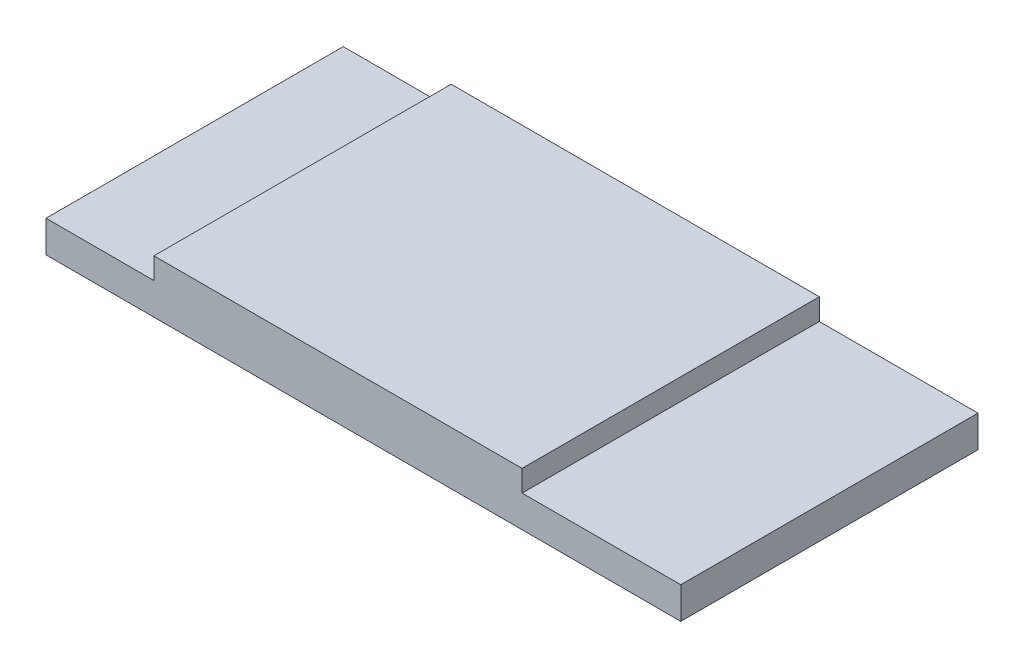
ISO-10303-21;
HEADER;
FILE_DESCRIPTION(('STEP AP214'),'2;1');
FILE_NAME('part.step','',(''),(''),'','','');
FILE_SCHEMA(('AUTOMOTIVE_DESIGN { 1 0 10303 214 1 1 1 1 }'));
ENDSEC;
DATA;
#1=APPLICATION_CONTEXT('core data for automotive mechanical design processes');
#2=APPLICATION_PROTOCOL_DEFINITION('international standard','automotive_design',2000,#1);
#3=PRODUCT_CONTEXT('',#1,'mechanical');
#4=PRODUCT('Part','Part','',(#3));
#5=PRODUCT_RELATED_PRODUCT_CATEGORY('part','',(#4));
#6=PRODUCT_DEFINITION_FORMATION('','',#4);
#7=PRODUCT_DEFINITION_CONTEXT('part definition',#1,'design');
#8=PRODUCT_DEFINITION('design','',#6,#7);
#9=PRODUCT_DEFINITION_SHAPE('','',#8);
#10=(LENGTH_UNIT() NAMED_UNIT(*) SI_UNIT(.MILLI.,.METRE.));
#11=(NAMED_UNIT(*) PLANE_ANGLE_UNIT() SI_UNIT($,.RADIAN.));
#12=(NAMED_UNIT(*) SI_UNIT($,.STERADIAN.) SOLID_ANGLE_UNIT());
#13=UNCERTAINTY_MEASURE_WITH_UNIT(LENGTH_MEASURE(1.E-05),#10,'distance_accuracy_value','');
#14=(GEOMETRIC_REPRESENTATION_CONTEXT(3) GLOBAL_UNCERTAINTY_ASSIGNED_CONTEXT((#13)) GLOBAL_UNIT_ASSIGNED_CONTEXT((#10,
#11,#12)) REPRESENTATION_CONTEXT('',''));
#15=CARTESIAN_POINT('',(0.,0.,0.));
#16=DIRECTION('',(0.,0.,1.));
#17=DIRECTION('',(1.,0.,0.));
#18=AXIS2_PLACEMENT_3D('',#15,#16,#17);
#19=CARTESIAN_POINT('',(0.,2.,0.));
#20=DIRECTION('',(0.,-1.,0.));
#21=DIRECTION('',(0.,0.,-1.));
#22=AXIS2_PLACEMENT_3D('',#19,#20,#21);
#23=PLANE('',#22);
#24=DIRECTION('',(0.,0.,1.));
#25=VECTOR('',#24,1.);
#26=CARTESIAN_POINT('',(6.8,2.,-18.73));
#27=LINE('',#26,#25);
#28=CARTESIAN_POINT('',(6.8,2.,-18.73));
#29=VERTEX_POINT('',#28);
#30=CARTESIAN_POINT('',(6.8,2.,0.));
#31=VERTEX_POINT('',#30);
#32=EDGE_CURVE('E54',#29,#31,#27,.T.);
#33=ORIENTED_EDGE('',*,*,#32,.F.);
#34=DIRECTION('',(-1.,0.,0.));
#35=VECTOR('',#34,1.);
#36=CARTESIAN_POINT('',(0.,2.,-18.73));
#37=LINE('',#36,#35);
#38=CARTESIAN_POINT('',(0.,2.,-18.73));
#39=VERTEX_POINT('',#38);
#40=EDGE_CURVE('E143',#29,#39,#37,.T.);
#41=ORIENTED_EDGE('',*,*,#40,.T.);
#42=DIRECTION('',(0.,0.,1.));
#43=VECTOR('',#42,1.);
#44=CARTESIAN_POINT('',(0.,2.,0.));
#45=LINE('',#44,#43);
#46=CARTESIAN_POINT('',(0.,2.,0.));
#47=VERTEX_POINT('',#46);
#48=EDGE_CURVE('E134',#39,#47,#45,.T.);
#49=ORIENTED_EDGE('',*,*,#48,.T.);
#50=DIRECTION('',(1.,0.,0.));
#51=VECTOR('',#50,1.);
#52=CARTESIAN_POINT('',(0.,2.,0.));
#53=LINE('',#52,#51);
#54=EDGE_CURVE('E139',#47,#31,#53,.T.);
#55=ORIENTED_EDGE('',*,*,#54,.T.);
#56=EDGE_LOOP('',(#33,#41,#49,#55));
#57=FACE_BOUND('',#56,.T.);
#58=ADVANCED_FACE('F39',(#57),#23,.F.);
#59=DIRECTION('',(0.,0.,-1.));
#60=VECTOR('',#59,1.);
#61=CARTESIAN_POINT('',(30.,2.,-18.73));
#62=LINE('',#61,#60);
#63=CARTESIAN_POINT('',(30.,2.,0.));
#64=VERTEX_POINT('',#63);
#65=CARTESIAN_POINT('',(30.,2.,-18.73));
#66=VERTEX_POINT('',#65);
#67=EDGE_CURVE('E62',#64,#66,#62,.T.);
#68=ORIENTED_EDGE('',*,*,#67,.F.);
#69=CARTESIAN_POINT('',(40.,2.,0.));
#70=VERTEX_POINT('',#69);
#71=EDGE_CURVE('E137',#64,#70,#53,.T.);
#72=ORIENTED_EDGE('',*,*,#71,.T.);
#73=DIRECTION('',(0.,0.,-1.));
#74=VECTOR('',#73,1.);
#75=CARTESIAN_POINT('',(40.,2.,0.));
#76=LINE('',#75,#74);
#77=CARTESIAN_POINT('',(40.,2.,-18.73));
#78=VERTEX_POINT('',#77);
#79=EDGE_CURVE('E141',#70,#78,#76,.T.);
#80=ORIENTED_EDGE('',*,*,#79,.T.);
#81=EDGE_CURVE('E144',#78,#66,#37,.T.);
#82=ORIENTED_EDGE('',*,*,#81,.T.);
#83=EDGE_LOOP('',(#68,#72,#80,#82));
#84=FACE_BOUND('',#83,.T.);
#85=ADVANCED_FACE('F183',(#84),#23,.F.);
#86=CARTESIAN_POINT('',(0.,2.,0.));
#87=DIRECTION('',(1.,0.,0.));
#88=DIRECTION('',(0.,0.,-1.));
#89=AXIS2_PLACEMENT_3D('',#86,#87,#88);
#90=PLANE('',#89);
#91=DIRECTION('',(0.,0.,1.));
#92=VECTOR('',#91,1.);
#93=CARTESIAN_POINT('',(0.,0.,0.));
#94=LINE('',#93,#92);
#95=CARTESIAN_POINT('',(0.,0.,-18.73));
#96=VERTEX_POINT('',#95);
#97=CARTESIAN_POINT('',(0.,0.,0.));
#98=VERTEX_POINT('',#97);
#99=EDGE_CURVE('E125',#96,#98,#94,.T.);
#100=ORIENTED_EDGE('',*,*,#99,.T.);
#101=DIRECTION('',(0.,-1.,0.));
#102=VECTOR('',#101,1.);
#103=CARTESIAN_POINT('',(0.,2.,0.));
#104=LINE('',#103,#102);
#105=EDGE_CURVE('E11',#47,#98,#104,.T.);
#106=ORIENTED_EDGE('',*,*,#105,.F.);
#107=ORIENTED_EDGE('',*,*,#48,.F.);
#108=DIRECTION('',(0.,-1.,0.));
#109=VECTOR('',#108,1.);
#110=CARTESIAN_POINT('',(0.,2.,-18.73));
#111=LINE('',#110,#109);
#112=EDGE_CURVE('E145',#39,#96,#111,.T.);
#113=ORIENTED_EDGE('',*,*,#112,.T.);
#114=EDGE_LOOP('',(#100,#106,#107,#113));
#115=FACE_BOUND('',#114,.T.);
#116=ADVANCED_FACE('F41',(#115),#90,.F.);
#117=CARTESIAN_POINT('',(0.,2.,0.));
#118=DIRECTION('',(0.,0.,-1.));
#119=DIRECTION('',(-1.,0.,0.));
#120=AXIS2_PLACEMENT_3D('',#117,#118,#119);
#121=PLANE('',#120);
#122=DIRECTION('',(1.,0.,0.));
#123=VECTOR('',#122,1.);
#124=CARTESIAN_POINT('',(0.,0.,0.));
#125=LINE('',#124,#123);
#126=CARTESIAN_POINT('',(40.,0.,0.));
#127=VERTEX_POINT('',#126);
#128=EDGE_CURVE('E128',#98,#127,#125,.T.);
#129=ORIENTED_EDGE('',*,*,#128,.T.);
#130=DIRECTION('',(0.,-1.,0.));
#131=VECTOR('',#130,1.);
#132=CARTESIAN_POINT('',(40.,2.,0.));
#133=LINE('',#132,#131);
#134=EDGE_CURVE('E47',#70,#127,#133,.T.);
#135=ORIENTED_EDGE('',*,*,#134,.F.);
#136=ORIENTED_EDGE('',*,*,#71,.F.);
#137=DIRECTION('',(0.,-1.,0.));
#138=VECTOR('',#137,1.);
#139=CARTESIAN_POINT('',(30.,3.35,0.));
#140=LINE('',#139,#138);
#141=CARTESIAN_POINT('',(30.,3.35,0.));
#142=VERTEX_POINT('',#141);
#143=EDGE_CURVE('E110',#142,#64,#140,.T.);
#144=ORIENTED_EDGE('',*,*,#143,.F.);
#145=DIRECTION('',(1.,0.,0.));
#146=VECTOR('',#145,1.);
#147=CARTESIAN_POINT('',(6.8,3.35,0.));
#148=LINE('',#147,#146);
#149=CARTESIAN_POINT('',(6.8,3.35,0.));
#150=VERTEX_POINT('',#149);
#151=EDGE_CURVE('E104',#150,#142,#148,.T.);
#152=ORIENTED_EDGE('',*,*,#151,.F.);
#153=DIRECTION('',(0.,-1.,0.));
#154=VECTOR('',#153,1.);
#155=CARTESIAN_POINT('',(6.8,3.35,0.));
#156=LINE('',#155,#154);
#157=EDGE_CURVE('E108',#150,#31,#156,.T.);
#158=ORIENTED_EDGE('',*,*,#157,.T.);
#159=ORIENTED_EDGE('',*,*,#54,.F.);
#160=ORIENTED_EDGE('',*,*,#105,.T.);
#161=EDGE_LOOP('',(#129,#135,#136,#144,#152,#158,#159,#160));
#162=FACE_BOUND('',#161,.T.);
#163=ADVANCED_FACE('F106',(#162),#121,.F.);
#164=CARTESIAN_POINT('',(40.,2.,0.));
#165=DIRECTION('',(-1.,0.,0.));
#166=DIRECTION('',(0.,0.,1.));
#167=AXIS2_PLACEMENT_3D('',#164,#165,#166);
#168=PLANE('',#167);
#169=DIRECTION('',(0.,0.,-1.));
#170=VECTOR('',#169,1.);
#171=CARTESIAN_POINT('',(40.,0.,0.));
#172=LINE('',#171,#170);
#173=CARTESIAN_POINT('',(40.,0.,-18.73));
#174=VERTEX_POINT('',#173);
#175=EDGE_CURVE('E148',#127,#174,#172,.T.);
#176=ORIENTED_EDGE('',*,*,#175,.T.);
#177=DIRECTION('',(0.,-1.,0.));
#178=VECTOR('',#177,1.);
#179=CARTESIAN_POINT('',(40.,2.,-18.73));
#180=LINE('',#179,#178);
#181=EDGE_CURVE('E153',#78,#174,#180,.T.);
#182=ORIENTED_EDGE('',*,*,#181,.F.);
#183=ORIENTED_EDGE('',*,*,#79,.F.);
#184=ORIENTED_EDGE('',*,*,#134,.T.);
#185=EDGE_LOOP('',(#176,#182,#183,#184));
#186=FACE_BOUND('',#185,.T.);
#187=ADVANCED_FACE('F160',(#186),#168,.F.);
#188=CARTESIAN_POINT('',(0.,2.,-18.73));
#189=DIRECTION('',(0.,0.,1.));
#190=DIRECTION('',(1.,0.,0.));
#191=AXIS2_PLACEMENT_3D('',#188,#189,#190);
#192=PLANE('',#191);
#193=DIRECTION('',(-1.,0.,0.));
#194=VECTOR('',#193,1.);
#195=CARTESIAN_POINT('',(0.,0.,-18.73));
#196=LINE('',#195,#194);
#197=EDGE_CURVE('E138',#174,#96,#196,.T.);
#198=ORIENTED_EDGE('',*,*,#197,.T.);
#199=ORIENTED_EDGE('',*,*,#112,.F.);
#200=ORIENTED_EDGE('',*,*,#40,.F.);
#201=DIRECTION('',(0.,-1.,0.));
#202=VECTOR('',#201,1.);
#203=CARTESIAN_POINT('',(6.8,3.35,-18.73));
#204=LINE('',#203,#202);
#205=CARTESIAN_POINT('',(6.8,3.35,-18.73));
#206=VERTEX_POINT('',#205);
#207=EDGE_CURVE('E173',#206,#29,#204,.T.);
#208=ORIENTED_EDGE('',*,*,#207,.F.);
#209=DIRECTION('',(-1.,0.,0.));
#210=VECTOR('',#209,1.);
#211=CARTESIAN_POINT('',(6.8,3.35,-18.73));
#212=LINE('',#211,#210);
#213=CARTESIAN_POINT('',(30.,3.35,-18.73));
#214=VERTEX_POINT('',#213);
#215=EDGE_CURVE('E119',#214,#206,#212,.T.);
#216=ORIENTED_EDGE('',*,*,#215,.F.);
#217=DIRECTION('',(0.,-1.,0.));
#218=VECTOR('',#217,1.);
#219=CARTESIAN_POINT('',(30.,3.35,-18.73));
#220=LINE('',#219,#218);
#221=EDGE_CURVE('E130',#214,#66,#220,.T.);
#222=ORIENTED_EDGE('',*,*,#221,.T.);
#223=ORIENTED_EDGE('',*,*,#81,.F.);
#224=ORIENTED_EDGE('',*,*,#181,.T.);
#225=EDGE_LOOP('',(#198,#199,#200,#208,#216,#222,#223,#224));
#226=FACE_BOUND('',#225,.T.);
#227=ADVANCED_FACE('F168',(#226),#192,.F.);
#228=CARTESIAN_POINT('',(0.,0.,0.));
#229=DIRECTION('',(0.,-1.,0.));
#230=DIRECTION('',(0.,0.,-1.));
#231=AXIS2_PLACEMENT_3D('',#228,#229,#230);
#232=PLANE('',#231);
#233=ORIENTED_EDGE('',*,*,#99,.F.);
#234=ORIENTED_EDGE('',*,*,#197,.F.);
#235=ORIENTED_EDGE('',*,*,#175,.F.);
#236=ORIENTED_EDGE('',*,*,#128,.F.);
#237=EDGE_LOOP('',(#233,#234,#235,#236));
#238=FACE_BOUND('',#237,.T.);
#239=ADVANCED_FACE('F165',(#238),#232,.T.);
#240=CARTESIAN_POINT('',(6.8,3.35,-18.73));
#241=DIRECTION('',(1.,0.,0.));
#242=DIRECTION('',(0.,0.,-1.));
#243=AXIS2_PLACEMENT_3D('',#240,#241,#242);
#244=PLANE('',#243);
#245=ORIENTED_EDGE('',*,*,#32,.T.);
#246=ORIENTED_EDGE('',*,*,#157,.F.);
#247=DIRECTION('',(0.,0.,1.));
#248=VECTOR('',#247,1.);
#249=CARTESIAN_POINT('',(6.8,3.35,-18.73));
#250=LINE('',#249,#248);
#251=EDGE_CURVE('E114',#206,#150,#250,.T.);
#252=ORIENTED_EDGE('',*,*,#251,.F.);
#253=ORIENTED_EDGE('',*,*,#207,.T.);
#254=EDGE_LOOP('',(#245,#246,#252,#253));
#255=FACE_BOUND('',#254,.T.);
#256=ADVANCED_FACE('F124',(#255),#244,.F.);
#257=CARTESIAN_POINT('',(30.,3.35,-18.73));
#258=DIRECTION('',(-1.,0.,0.));
#259=DIRECTION('',(0.,0.,1.));
#260=AXIS2_PLACEMENT_3D('',#257,#258,#259);
#261=PLANE('',#260);
#262=ORIENTED_EDGE('',*,*,#67,.T.);
#263=ORIENTED_EDGE('',*,*,#221,.F.);
#264=DIRECTION('',(0.,0.,-1.));
#265=VECTOR('',#264,1.);
#266=CARTESIAN_POINT('',(30.,3.35,-18.73));
#267=LINE('',#266,#265);
#268=EDGE_CURVE('E113',#142,#214,#267,.T.);
#269=ORIENTED_EDGE('',*,*,#268,.F.);
#270=ORIENTED_EDGE('',*,*,#143,.T.);
#271=EDGE_LOOP('',(#262,#263,#269,#270));
#272=FACE_BOUND('',#271,.T.);
#273=ADVANCED_FACE('F182',(#272),#261,.F.);
#274=CARTESIAN_POINT('',(0.,3.35,0.));
#275=DIRECTION('',(0.,1.,0.));
#276=DIRECTION('',(0.,0.,1.));
#277=AXIS2_PLACEMENT_3D('',#274,#275,#276);
#278=PLANE('',#277);
#279=ORIENTED_EDGE('',*,*,#251,.T.);
#280=ORIENTED_EDGE('',*,*,#151,.T.);
#281=ORIENTED_EDGE('',*,*,#268,.T.);
#282=ORIENTED_EDGE('',*,*,#215,.T.);
#283=EDGE_LOOP('',(#279,#280,#281,#282));
#284=FACE_BOUND('',#283,.T.);
#285=ADVANCED_FACE('F117',(#284),#278,.T.);
#286=CLOSED_SHELL('',(#58,#85,#116,#163,#187,#227,#239,#256,#273,#285));
#287=MANIFOLD_SOLID_BREP('B2',#286);
#288=ADVANCED_BREP_SHAPE_REPRESENTATION('',(#18,#287),#14);
#289=SHAPE_DEFINITION_REPRESENTATION(#9,#288);
ENDSEC;
END-ISO-10303-21;
